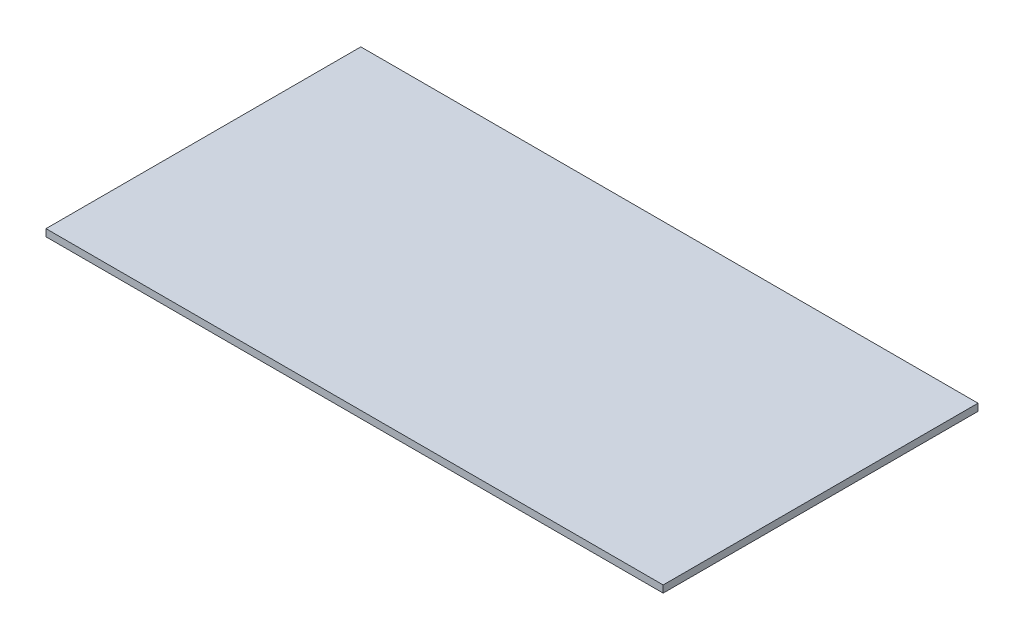
ISO-10303-21;
HEADER;
FILE_DESCRIPTION(('STEP AP214'),'2;1');
FILE_NAME('part.step','',(''),(''),'','','');
FILE_SCHEMA(('AUTOMOTIVE_DESIGN { 1 0 10303 214 1 1 1 1 }'));
ENDSEC;
DATA;
#1=APPLICATION_CONTEXT('core data for automotive mechanical design processes');
#2=APPLICATION_PROTOCOL_DEFINITION('international standard','automotive_design',2000,#1);
#3=PRODUCT_CONTEXT('',#1,'mechanical');
#4=PRODUCT('Part','Part','',(#3));
#5=PRODUCT_RELATED_PRODUCT_CATEGORY('part','',(#4));
#6=PRODUCT_DEFINITION_FORMATION('','',#4);
#7=PRODUCT_DEFINITION_CONTEXT('part definition',#1,'design');
#8=PRODUCT_DEFINITION('design','',#6,#7);
#9=PRODUCT_DEFINITION_SHAPE('','',#8);
#10=(LENGTH_UNIT() NAMED_UNIT(*) SI_UNIT(.MILLI.,.METRE.));
#11=(NAMED_UNIT(*) PLANE_ANGLE_UNIT() SI_UNIT($,.RADIAN.));
#12=(NAMED_UNIT(*) SI_UNIT($,.STERADIAN.) SOLID_ANGLE_UNIT());
#13=UNCERTAINTY_MEASURE_WITH_UNIT(LENGTH_MEASURE(1.E-05),#10,'distance_accuracy_value','');
#14=(GEOMETRIC_REPRESENTATION_CONTEXT(3) GLOBAL_UNCERTAINTY_ASSIGNED_CONTEXT((#13)) GLOBAL_UNIT_ASSIGNED_CONTEXT((#10,
#11,#12)) REPRESENTATION_CONTEXT('',''));
#15=CARTESIAN_POINT('',(0.,0.,0.));
#16=DIRECTION('',(0.,0.,1.));
#17=DIRECTION('',(1.,0.,0.));
#18=AXIS2_PLACEMENT_3D('',#15,#16,#17);
#19=CARTESIAN_POINT('',(0.,1.651,0.));
#20=DIRECTION('',(1.,0.,0.));
#21=DIRECTION('',(0.,0.,-1.));
#22=AXIS2_PLACEMENT_3D('',#19,#20,#21);
#23=PLANE('',#22);
#24=DIRECTION('',(0.,0.,1.));
#25=VECTOR('',#24,1.);
#26=CARTESIAN_POINT('',(0.,0.,0.));
#27=LINE('',#26,#25);
#28=CARTESIAN_POINT('',(0.,0.,-73.1819689897527));
#29=VERTEX_POINT('',#28);
#30=CARTESIAN_POINT('',(0.,0.,0.));
#31=VERTEX_POINT('',#30);
#32=EDGE_CURVE('E107',#29,#31,#27,.T.);
#33=ORIENTED_EDGE('',*,*,#32,.T.);
#34=DIRECTION('',(0.,-1.,0.));
#35=VECTOR('',#34,1.);
#36=CARTESIAN_POINT('',(0.,1.651,0.));
#37=LINE('',#36,#35);
#38=CARTESIAN_POINT('',(0.,1.651,0.));
#39=VERTEX_POINT('',#38);
#40=EDGE_CURVE('E11',#39,#31,#37,.T.);
#41=ORIENTED_EDGE('',*,*,#40,.F.);
#42=DIRECTION('',(0.,0.,1.));
#43=VECTOR('',#42,1.);
#44=CARTESIAN_POINT('',(0.,1.651,0.));
#45=LINE('',#44,#43);
#46=CARTESIAN_POINT('',(0.,1.651,-73.1819689897527));
#47=VERTEX_POINT('',#46);
#48=EDGE_CURVE('E91',#47,#39,#45,.T.);
#49=ORIENTED_EDGE('',*,*,#48,.F.);
#50=DIRECTION('',(0.,-1.,0.));
#51=VECTOR('',#50,1.);
#52=CARTESIAN_POINT('',(0.,1.651,-73.1819689897527));
#53=LINE('',#52,#51);
#54=EDGE_CURVE('E103',#47,#29,#53,.T.);
#55=ORIENTED_EDGE('',*,*,#54,.T.);
#56=EDGE_LOOP('',(#33,#41,#49,#55));
#57=FACE_BOUND('',#56,.T.);
#58=ADVANCED_FACE('F39',(#57),#23,.F.);
#59=CARTESIAN_POINT('',(0.,1.651,0.));
#60=DIRECTION('',(0.,0.,-1.));
#61=DIRECTION('',(-1.,0.,0.));
#62=AXIS2_PLACEMENT_3D('',#59,#60,#61);
#63=PLANE('',#62);
#64=DIRECTION('',(1.,0.,0.));
#65=VECTOR('',#64,1.);
#66=CARTESIAN_POINT('',(0.,0.,0.));
#67=LINE('',#66,#65);
#68=CARTESIAN_POINT('',(143.461104136488,0.,0.));
#69=VERTEX_POINT('',#68);
#70=EDGE_CURVE('E96',#31,#69,#67,.T.);
#71=ORIENTED_EDGE('',*,*,#70,.T.);
#72=DIRECTION('',(0.,-1.,0.));
#73=VECTOR('',#72,1.);
#74=CARTESIAN_POINT('',(143.461104136488,1.651,0.));
#75=LINE('',#74,#73);
#76=CARTESIAN_POINT('',(143.461104136488,1.651,0.));
#77=VERTEX_POINT('',#76);
#78=EDGE_CURVE('E48',#77,#69,#75,.T.);
#79=ORIENTED_EDGE('',*,*,#78,.F.);
#80=DIRECTION('',(1.,0.,0.));
#81=VECTOR('',#80,1.);
#82=CARTESIAN_POINT('',(0.,1.651,0.));
#83=LINE('',#82,#81);
#84=EDGE_CURVE('E86',#39,#77,#83,.T.);
#85=ORIENTED_EDGE('',*,*,#84,.F.);
#86=ORIENTED_EDGE('',*,*,#40,.T.);
#87=EDGE_LOOP('',(#71,#79,#85,#86));
#88=FACE_BOUND('',#87,.T.);
#89=ADVANCED_FACE('F95',(#88),#63,.F.);
#90=CARTESIAN_POINT('',(143.461104136488,1.651,0.));
#91=DIRECTION('',(-1.,0.,0.));
#92=DIRECTION('',(0.,0.,1.));
#93=AXIS2_PLACEMENT_3D('',#90,#91,#92);
#94=PLANE('',#93);
#95=DIRECTION('',(0.,0.,-1.));
#96=VECTOR('',#95,1.);
#97=CARTESIAN_POINT('',(143.461104136488,0.,0.));
#98=LINE('',#97,#96);
#99=CARTESIAN_POINT('',(143.461104136488,0.,-73.1819689897527));
#100=VERTEX_POINT('',#99);
#101=EDGE_CURVE('E73',#69,#100,#98,.T.);
#102=ORIENTED_EDGE('',*,*,#101,.T.);
#103=DIRECTION('',(0.,-1.,0.));
#104=VECTOR('',#103,1.);
#105=CARTESIAN_POINT('',(143.461104136488,1.651,-73.1819689897527));
#106=LINE('',#105,#104);
#107=CARTESIAN_POINT('',(143.461104136488,1.651,-73.1819689897527));
#108=VERTEX_POINT('',#107);
#109=EDGE_CURVE('E98',#108,#100,#106,.T.);
#110=ORIENTED_EDGE('',*,*,#109,.F.);
#111=DIRECTION('',(0.,0.,-1.));
#112=VECTOR('',#111,1.);
#113=CARTESIAN_POINT('',(143.461104136488,1.651,0.));
#114=LINE('',#113,#112);
#115=EDGE_CURVE('E89',#77,#108,#114,.T.);
#116=ORIENTED_EDGE('',*,*,#115,.F.);
#117=ORIENTED_EDGE('',*,*,#78,.T.);
#118=EDGE_LOOP('',(#102,#110,#116,#117));
#119=FACE_BOUND('',#118,.T.);
#120=ADVANCED_FACE('F99',(#119),#94,.F.);
#121=CARTESIAN_POINT('',(0.,1.651,-73.1819689897527));
#122=DIRECTION('',(0.,0.,1.));
#123=DIRECTION('',(1.,0.,0.));
#124=AXIS2_PLACEMENT_3D('',#121,#122,#123);
#125=PLANE('',#124);
#126=DIRECTION('',(-1.,0.,0.));
#127=VECTOR('',#126,1.);
#128=CARTESIAN_POINT('',(0.,0.,-73.1819689897527));
#129=LINE('',#128,#127);
#130=EDGE_CURVE('E79',#100,#29,#129,.T.);
#131=ORIENTED_EDGE('',*,*,#130,.T.);
#132=ORIENTED_EDGE('',*,*,#54,.F.);
#133=DIRECTION('',(-1.,0.,0.));
#134=VECTOR('',#133,1.);
#135=CARTESIAN_POINT('',(0.,1.651,-73.1819689897527));
#136=LINE('',#135,#134);
#137=EDGE_CURVE('E56',#108,#47,#136,.T.);
#138=ORIENTED_EDGE('',*,*,#137,.F.);
#139=ORIENTED_EDGE('',*,*,#109,.T.);
#140=EDGE_LOOP('',(#131,#132,#138,#139));
#141=FACE_BOUND('',#140,.T.);
#142=ADVANCED_FACE('F120',(#141),#125,.F.);
#143=CARTESIAN_POINT('',(0.,1.651,0.));
#144=DIRECTION('',(0.,-1.,0.));
#145=DIRECTION('',(0.,0.,-1.));
#146=AXIS2_PLACEMENT_3D('',#143,#144,#145);
#147=PLANE('',#146);
#148=ORIENTED_EDGE('',*,*,#48,.T.);
#149=ORIENTED_EDGE('',*,*,#84,.T.);
#150=ORIENTED_EDGE('',*,*,#115,.T.);
#151=ORIENTED_EDGE('',*,*,#137,.T.);
#152=EDGE_LOOP('',(#148,#149,#150,#151));
#153=FACE_BOUND('',#152,.T.);
#154=ADVANCED_FACE('F87',(#153),#147,.F.);
#155=CARTESIAN_POINT('',(0.,0.,0.));
#156=DIRECTION('',(0.,-1.,0.));
#157=DIRECTION('',(0.,0.,-1.));
#158=AXIS2_PLACEMENT_3D('',#155,#156,#157);
#159=PLANE('',#158);
#160=ORIENTED_EDGE('',*,*,#32,.F.);
#161=ORIENTED_EDGE('',*,*,#130,.F.);
#162=ORIENTED_EDGE('',*,*,#101,.F.);
#163=ORIENTED_EDGE('',*,*,#70,.F.);
#164=EDGE_LOOP('',(#160,#161,#162,#163));
#165=FACE_BOUND('',#164,.T.);
#166=ADVANCED_FACE('F123',(#165),#159,.T.);
#167=CLOSED_SHELL('',(#58,#89,#120,#142,#154,#166));
#168=MANIFOLD_SOLID_BREP('B2',#167);
#169=ADVANCED_BREP_SHAPE_REPRESENTATION('',(#18,#168),#14);
#170=SHAPE_DEFINITION_REPRESENTATION(#9,#169);
ENDSEC;
END-ISO-10303-21;
